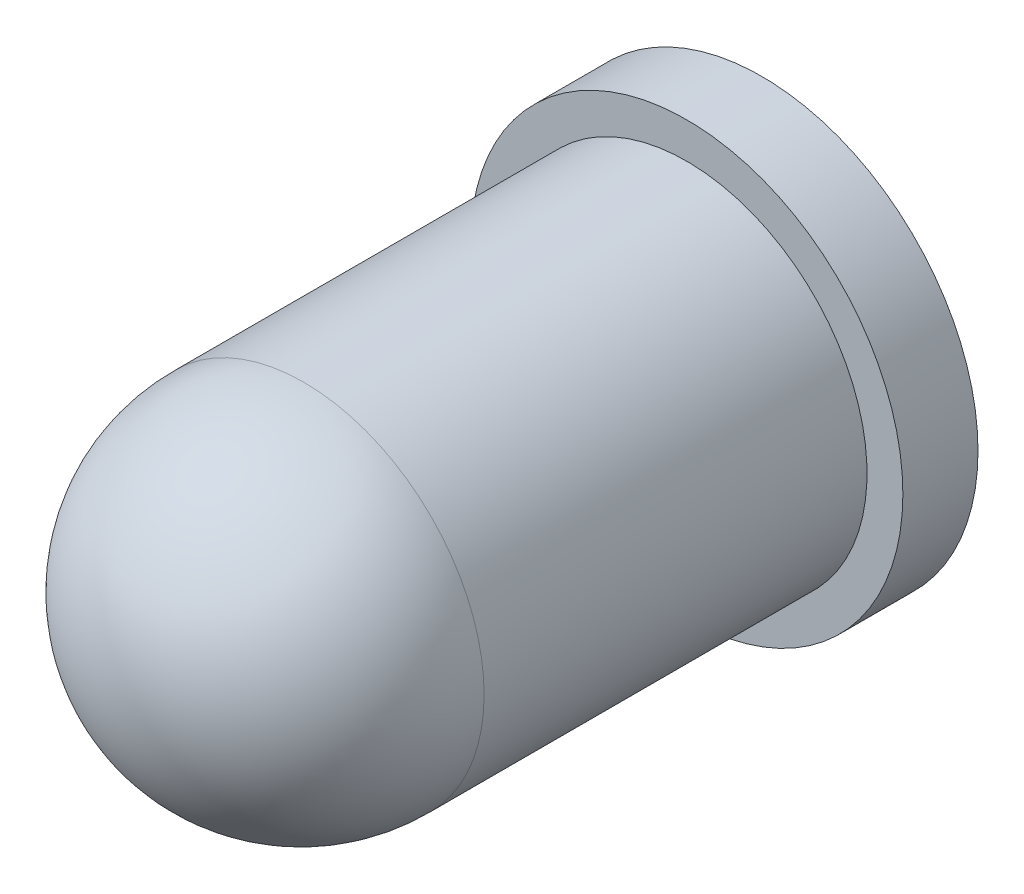
ISO-10303-21;
HEADER;
FILE_DESCRIPTION(('STEP AP214'),'2;1');
FILE_NAME('part.step','',(''),(''),'','','');
FILE_SCHEMA(('AUTOMOTIVE_DESIGN { 1 0 10303 214 1 1 1 1 }'));
ENDSEC;
DATA;
#1=APPLICATION_CONTEXT('core data for automotive mechanical design processes');
#2=APPLICATION_PROTOCOL_DEFINITION('international standard','automotive_design',2000,#1);
#3=PRODUCT_CONTEXT('',#1,'mechanical');
#4=PRODUCT('Part','Part','',(#3));
#5=PRODUCT_RELATED_PRODUCT_CATEGORY('part','',(#4));
#6=PRODUCT_DEFINITION_FORMATION('','',#4);
#7=PRODUCT_DEFINITION_CONTEXT('part definition',#1,'design');
#8=PRODUCT_DEFINITION('design','',#6,#7);
#9=PRODUCT_DEFINITION_SHAPE('','',#8);
#10=(LENGTH_UNIT() NAMED_UNIT(*) SI_UNIT(.MILLI.,.METRE.));
#11=(NAMED_UNIT(*) PLANE_ANGLE_UNIT() SI_UNIT($,.RADIAN.));
#12=(NAMED_UNIT(*) SI_UNIT($,.STERADIAN.) SOLID_ANGLE_UNIT());
#13=UNCERTAINTY_MEASURE_WITH_UNIT(LENGTH_MEASURE(1.E-05),#10,'distance_accuracy_value','');
#14=(GEOMETRIC_REPRESENTATION_CONTEXT(3) GLOBAL_UNCERTAINTY_ASSIGNED_CONTEXT((#13)) GLOBAL_UNIT_ASSIGNED_CONTEXT((#10,
#11,#12)) REPRESENTATION_CONTEXT('',''));
#15=CARTESIAN_POINT('',(0.,0.,0.));
#16=DIRECTION('',(0.,0.,1.));
#17=DIRECTION('',(1.,0.,0.));
#18=AXIS2_PLACEMENT_3D('',#15,#16,#17);
#19=CARTESIAN_POINT('',(0.,0.,6.35));
#20=DIRECTION('',(0.,0.,-1.));
#21=DIRECTION('',(-1.,0.,0.));
#22=AXIS2_PLACEMENT_3D('',#19,#20,#21);
#23=CYLINDRICAL_SURFACE('',#22,2.5);
#24=CARTESIAN_POINT('',(0.,0.,6.35));
#25=DIRECTION('',(0.,0.,1.));
#26=DIRECTION('',(1.,0.,0.));
#27=AXIS2_PLACEMENT_3D('',#24,#25,#26);
#28=CIRCLE('',#27,2.5);
#29=CARTESIAN_POINT('',(2.5,0.,6.35));
#30=VERTEX_POINT('',#29);
#31=EDGE_CURVE('E37',#30,#30,#28,.T.);
#32=ORIENTED_EDGE('',*,*,#31,.F.);
#33=EDGE_LOOP('',(#32));
#34=FACE_BOUND('',#33,.T.);
#35=CARTESIAN_POINT('',(0.,0.,1.0414));
#36=DIRECTION('',(0.,0.,-1.));
#37=DIRECTION('',(-1.,0.,0.));
#38=AXIS2_PLACEMENT_3D('',#35,#36,#37);
#39=CIRCLE('',#38,2.5);
#40=CARTESIAN_POINT('',(-2.5,0.,1.0414));
#41=VERTEX_POINT('',#40);
#42=EDGE_CURVE('E10',#41,#41,#39,.T.);
#43=ORIENTED_EDGE('',*,*,#42,.F.);
#44=EDGE_LOOP('',(#43));
#45=FACE_BOUND('',#44,.T.);
#46=ADVANCED_FACE('F30',(#34,#45),#23,.T.);
#47=CARTESIAN_POINT('',(0.,0.,6.38968503937008));
#48=DIRECTION('',(0.,0.,1.));
#49=DIRECTION('',(1.,0.,0.));
#50=AXIS2_PLACEMENT_3D('',#47,#48,#49);
#51=SPHERICAL_SURFACE('',#50,2.50031496062992);
#52=ORIENTED_EDGE('',*,*,#31,.T.);
#53=EDGE_LOOP('',(#52));
#54=FACE_BOUND('',#53,.T.);
#55=ADVANCED_FACE('F32',(#54),#51,.T.);
#56=CARTESIAN_POINT('',(0.,0.,1.0414));
#57=DIRECTION('',(0.,0.,-1.));
#58=DIRECTION('',(-1.,0.,0.));
#59=AXIS2_PLACEMENT_3D('',#56,#57,#58);
#60=PLANE('',#59);
#61=CARTESIAN_POINT('',(0.,0.,1.0414));
#62=DIRECTION('',(0.,0.,-1.));
#63=DIRECTION('',(-1.,0.,0.));
#64=AXIS2_PLACEMENT_3D('',#61,#62,#63);
#65=CIRCLE('',#64,2.9972);
#66=CARTESIAN_POINT('',(-2.9972,0.,1.0414));
#67=VERTEX_POINT('',#66);
#68=EDGE_CURVE('E41',#67,#67,#65,.T.);
#69=ORIENTED_EDGE('',*,*,#68,.F.);
#70=EDGE_LOOP('',(#69));
#71=FACE_BOUND('',#70,.T.);
#72=ORIENTED_EDGE('',*,*,#42,.T.);
#73=EDGE_LOOP('',(#72));
#74=FACE_BOUND('',#73,.T.);
#75=ADVANCED_FACE('F55',(#71,#74),#60,.F.);
#76=CARTESIAN_POINT('',(0.,0.,1.0414));
#77=DIRECTION('',(0.,0.,-1.));
#78=DIRECTION('',(-1.,0.,0.));
#79=AXIS2_PLACEMENT_3D('',#76,#77,#78);
#80=CYLINDRICAL_SURFACE('',#79,2.9972);
#81=ORIENTED_EDGE('',*,*,#68,.T.);
#82=EDGE_LOOP('',(#81));
#83=FACE_BOUND('',#82,.T.);
#84=CARTESIAN_POINT('',(0.,0.,0.));
#85=DIRECTION('',(0.,0.,-1.));
#86=DIRECTION('',(-1.,0.,0.));
#87=AXIS2_PLACEMENT_3D('',#84,#85,#86);
#88=CIRCLE('',#87,2.9972);
#89=CARTESIAN_POINT('',(-2.9972,0.,0.));
#90=VERTEX_POINT('',#89);
#91=EDGE_CURVE('E45',#90,#90,#88,.T.);
#92=ORIENTED_EDGE('',*,*,#91,.F.);
#93=EDGE_LOOP('',(#92));
#94=FACE_BOUND('',#93,.T.);
#95=ADVANCED_FACE('F53',(#83,#94),#80,.T.);
#96=CARTESIAN_POINT('',(0.,0.,0.));
#97=DIRECTION('',(0.,0.,1.));
#98=DIRECTION('',(1.,0.,0.));
#99=AXIS2_PLACEMENT_3D('',#96,#97,#98);
#100=PLANE('',#99);
#101=ORIENTED_EDGE('',*,*,#91,.T.);
#102=EDGE_LOOP('',(#101));
#103=FACE_BOUND('',#102,.T.);
#104=ADVANCED_FACE('F51',(#103),#100,.F.);
#105=CLOSED_SHELL('',(#46,#55,#75,#95,#104));
#106=MANIFOLD_SOLID_BREP('B2',#105);
#107=ADVANCED_BREP_SHAPE_REPRESENTATION('',(#18,#106),#14);
#108=SHAPE_DEFINITION_REPRESENTATION(#9,#107);
ENDSEC;
END-ISO-10303-21;
